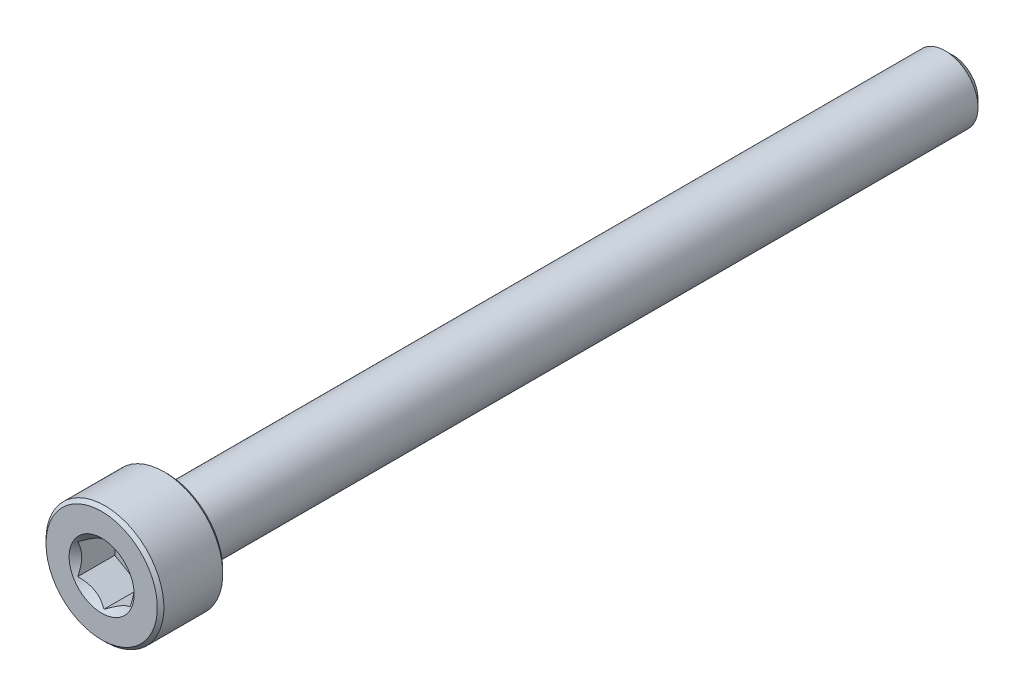
ISO-10303-21;
HEADER;
FILE_DESCRIPTION(('STEP AP214'),'2;1');
FILE_NAME('part.step','',(''),(''),'','','');
FILE_SCHEMA(('AUTOMOTIVE_DESIGN { 1 0 10303 214 1 1 1 1 }'));
ENDSEC;
DATA;
#1=APPLICATION_CONTEXT('core data for automotive mechanical design processes');
#2=APPLICATION_PROTOCOL_DEFINITION('international standard','automotive_design',2000,#1);
#3=PRODUCT_CONTEXT('',#1,'mechanical');
#4=PRODUCT('Part','Part','',(#3));
#5=PRODUCT_RELATED_PRODUCT_CATEGORY('part','',(#4));
#6=PRODUCT_DEFINITION_FORMATION('','',#4);
#7=PRODUCT_DEFINITION_CONTEXT('part definition',#1,'design');
#8=PRODUCT_DEFINITION('design','',#6,#7);
#9=PRODUCT_DEFINITION_SHAPE('','',#8);
#10=(LENGTH_UNIT() NAMED_UNIT(*) SI_UNIT(.MILLI.,.METRE.));
#11=(NAMED_UNIT(*) PLANE_ANGLE_UNIT() SI_UNIT($,.RADIAN.));
#12=(NAMED_UNIT(*) SI_UNIT($,.STERADIAN.) SOLID_ANGLE_UNIT());
#13=UNCERTAINTY_MEASURE_WITH_UNIT(LENGTH_MEASURE(1.E-05),#10,'distance_accuracy_value','');
#14=(GEOMETRIC_REPRESENTATION_CONTEXT(3) GLOBAL_UNCERTAINTY_ASSIGNED_CONTEXT((#13)) GLOBAL_UNIT_ASSIGNED_CONTEXT((#10,
#11,#12)) REPRESENTATION_CONTEXT('',''));
#15=CARTESIAN_POINT('',(0.,0.,0.));
#16=DIRECTION('',(0.,0.,1.));
#17=DIRECTION('',(1.,0.,0.));
#18=AXIS2_PLACEMENT_3D('',#15,#16,#17);
#19=CARTESIAN_POINT('',(0.,0.957716426222754,-16.25));
#20=DIRECTION('',(0.,0.,-1.));
#21=DIRECTION('',(-1.,0.,0.));
#22=AXIS2_PLACEMENT_3D('',#19,#20,#21);
#23=PLANE('',#22);
#24=CARTESIAN_POINT('',(0.,0.,-16.25));
#25=DIRECTION('',(0.,0.,-1.));
#26=DIRECTION('',(-1.,0.,0.));
#27=AXIS2_PLACEMENT_3D('',#24,#25,#26);
#28=CIRCLE('',#27,0.957716426222754);
#29=CARTESIAN_POINT('',(-0.957716426222754,0.,-16.25));
#30=VERTEX_POINT('',#29);
#31=EDGE_CURVE('E50',#30,#30,#28,.T.);
#32=ORIENTED_EDGE('',*,*,#31,.T.);
#33=EDGE_LOOP('',(#32));
#34=FACE_BOUND('',#33,.T.);
#35=ADVANCED_FACE('F37',(#34),#23,.T.);
#36=CARTESIAN_POINT('',(0.,0.,-16.25));
#37=DIRECTION('',(0.,0.,1.));
#38=DIRECTION('',(1.,0.,0.));
#39=AXIS2_PLACEMENT_3D('',#36,#37,#38);
#40=CONICAL_SURFACE('',#39,0.957716426222754,0.785398163397444);
#41=CARTESIAN_POINT('',(0.,0.,-15.9577164262228));
#42=DIRECTION('',(0.,0.,-1.));
#43=DIRECTION('',(-1.,0.,0.));
#44=AXIS2_PLACEMENT_3D('',#41,#42,#43);
#45=CIRCLE('',#44,1.25);
#46=CARTESIAN_POINT('',(-1.25,0.,-15.9577164262228));
#47=VERTEX_POINT('',#46);
#48=EDGE_CURVE('E153',#47,#47,#45,.T.);
#49=ORIENTED_EDGE('',*,*,#48,.T.);
#50=EDGE_LOOP('',(#49));
#51=FACE_BOUND('',#50,.T.);
#52=ORIENTED_EDGE('',*,*,#31,.F.);
#53=EDGE_LOOP('',(#52));
#54=FACE_BOUND('',#53,.T.);
#55=ADVANCED_FACE('F159',(#51,#54),#40,.T.);
#56=CARTESIAN_POINT('',(0.,0.,-16.25));
#57=DIRECTION('',(0.,0.,-1.));
#58=DIRECTION('',(-1.,0.,0.));
#59=AXIS2_PLACEMENT_3D('',#56,#57,#58);
#60=CYLINDRICAL_SURFACE('',#59,1.25);
#61=CARTESIAN_POINT('',(0.,0.,13.625));
#62=DIRECTION('',(0.,0.,-1.));
#63=DIRECTION('',(-1.,0.,0.));
#64=AXIS2_PLACEMENT_3D('',#61,#62,#63);
#65=CIRCLE('',#64,1.25);
#66=CARTESIAN_POINT('',(-1.25,0.,13.625));
#67=VERTEX_POINT('',#66);
#68=EDGE_CURVE('E150',#67,#67,#65,.T.);
#69=ORIENTED_EDGE('',*,*,#68,.T.);
#70=EDGE_LOOP('',(#69));
#71=FACE_BOUND('',#70,.T.);
#72=ORIENTED_EDGE('',*,*,#48,.F.);
#73=EDGE_LOOP('',(#72));
#74=FACE_BOUND('',#73,.T.);
#75=ADVANCED_FACE('F161',(#71,#74),#60,.T.);
#76=CARTESIAN_POINT('',(0.,0.,13.625));
#77=DIRECTION('',(0.,0.,-1.));
#78=DIRECTION('',(-1.,0.,0.));
#79=AXIS2_PLACEMENT_3D('',#76,#77,#78);
#80=TOROIDAL_SURFACE('',#79,1.375,0.125);
#81=CARTESIAN_POINT('',(0.,0.,13.75));
#82=DIRECTION('',(0.,0.,-1.));
#83=DIRECTION('',(-1.,0.,0.));
#84=AXIS2_PLACEMENT_3D('',#81,#82,#83);
#85=CIRCLE('',#84,1.375);
#86=CARTESIAN_POINT('',(-1.375,0.,13.75));
#87=VERTEX_POINT('',#86);
#88=EDGE_CURVE('E147',#87,#87,#85,.T.);
#89=ORIENTED_EDGE('',*,*,#88,.T.);
#90=EDGE_LOOP('',(#89));
#91=FACE_BOUND('',#90,.T.);
#92=ORIENTED_EDGE('',*,*,#68,.F.);
#93=EDGE_LOOP('',(#92));
#94=FACE_BOUND('',#93,.T.);
#95=ADVANCED_FACE('F167',(#91,#94),#80,.F.);
#96=CARTESIAN_POINT('',(0.,2.125,13.75));
#97=DIRECTION('',(0.,0.,-1.));
#98=DIRECTION('',(-1.,0.,0.));
#99=AXIS2_PLACEMENT_3D('',#96,#97,#98);
#100=PLANE('',#99);
#101=CARTESIAN_POINT('',(0.,0.,13.75));
#102=DIRECTION('',(0.,0.,-1.));
#103=DIRECTION('',(-1.,0.,0.));
#104=AXIS2_PLACEMENT_3D('',#101,#102,#103);
#105=CIRCLE('',#104,2.125);
#106=CARTESIAN_POINT('',(-2.125,0.,13.75));
#107=VERTEX_POINT('',#106);
#108=EDGE_CURVE('E144',#107,#107,#105,.T.);
#109=ORIENTED_EDGE('',*,*,#108,.T.);
#110=EDGE_LOOP('',(#109));
#111=FACE_BOUND('',#110,.T.);
#112=ORIENTED_EDGE('',*,*,#88,.F.);
#113=EDGE_LOOP('',(#112));
#114=FACE_BOUND('',#113,.T.);
#115=ADVANCED_FACE('F173',(#111,#114),#100,.T.);
#116=CARTESIAN_POINT('',(0.,0.,13.75));
#117=DIRECTION('',(0.,0.,1.));
#118=DIRECTION('',(1.,0.,0.));
#119=AXIS2_PLACEMENT_3D('',#116,#117,#118);
#120=CONICAL_SURFACE('',#119,2.125,0.78539816339745);
#121=CARTESIAN_POINT('',(0.,0.,13.875));
#122=DIRECTION('',(0.,0.,-1.));
#123=DIRECTION('',(-1.,0.,0.));
#124=AXIS2_PLACEMENT_3D('',#121,#122,#123);
#125=CIRCLE('',#124,2.25);
#126=CARTESIAN_POINT('',(-2.25,0.,13.875));
#127=VERTEX_POINT('',#126);
#128=EDGE_CURVE('E141',#127,#127,#125,.T.);
#129=ORIENTED_EDGE('',*,*,#128,.T.);
#130=EDGE_LOOP('',(#129));
#131=FACE_BOUND('',#130,.T.);
#132=ORIENTED_EDGE('',*,*,#108,.F.);
#133=EDGE_LOOP('',(#132));
#134=FACE_BOUND('',#133,.T.);
#135=ADVANCED_FACE('F177',(#131,#134),#120,.T.);
#136=CARTESIAN_POINT('',(0.,0.,-16.25));
#137=DIRECTION('',(0.,0.,-1.));
#138=DIRECTION('',(-1.,0.,0.));
#139=AXIS2_PLACEMENT_3D('',#136,#137,#138);
#140=CYLINDRICAL_SURFACE('',#139,2.25);
#141=CARTESIAN_POINT('',(0.,0.,16.125));
#142=DIRECTION('',(0.,0.,-1.));
#143=DIRECTION('',(-1.,0.,0.));
#144=AXIS2_PLACEMENT_3D('',#141,#142,#143);
#145=CIRCLE('',#144,2.25);
#146=CARTESIAN_POINT('',(-2.25,0.,16.125));
#147=VERTEX_POINT('',#146);
#148=EDGE_CURVE('E138',#147,#147,#145,.T.);
#149=ORIENTED_EDGE('',*,*,#148,.T.);
#150=EDGE_LOOP('',(#149));
#151=FACE_BOUND('',#150,.T.);
#152=ORIENTED_EDGE('',*,*,#128,.F.);
#153=EDGE_LOOP('',(#152));
#154=FACE_BOUND('',#153,.T.);
#155=ADVANCED_FACE('F181',(#151,#154),#140,.T.);
#156=CARTESIAN_POINT('',(0.,0.,16.125));
#157=DIRECTION('',(0.,0.,-1.));
#158=DIRECTION('',(-1.,0.,0.));
#159=AXIS2_PLACEMENT_3D('',#156,#157,#158);
#160=CONICAL_SURFACE('',#159,2.25,0.78539816339745);
#161=CARTESIAN_POINT('',(0.,0.,16.25));
#162=DIRECTION('',(0.,0.,-1.));
#163=DIRECTION('',(-1.,0.,0.));
#164=AXIS2_PLACEMENT_3D('',#161,#162,#163);
#165=CIRCLE('',#164,2.125);
#166=CARTESIAN_POINT('',(-2.125,0.,16.25));
#167=VERTEX_POINT('',#166);
#168=EDGE_CURVE('E135',#167,#167,#165,.T.);
#169=ORIENTED_EDGE('',*,*,#168,.T.);
#170=EDGE_LOOP('',(#169));
#171=FACE_BOUND('',#170,.T.);
#172=ORIENTED_EDGE('',*,*,#148,.F.);
#173=EDGE_LOOP('',(#172));
#174=FACE_BOUND('',#173,.T.);
#175=ADVANCED_FACE('F185',(#171,#174),#160,.T.);
#176=CARTESIAN_POINT('',(0.,0.,16.25));
#177=DIRECTION('',(0.,0.,1.));
#178=DIRECTION('',(1.,0.,0.));
#179=AXIS2_PLACEMENT_3D('',#176,#177,#178);
#180=PLANE('',#179);
#181=CARTESIAN_POINT('',(0.,0.,16.25));
#182=DIRECTION('',(0.,0.,1.));
#183=DIRECTION('',(1.,0.,0.));
#184=AXIS2_PLACEMENT_3D('',#181,#182,#183);
#185=CIRCLE('',#184,1.2413030787577);
#186=CARTESIAN_POINT('',(1.2413030787577,0.,16.25));
#187=VERTEX_POINT('',#186);
#188=EDGE_CURVE('E109',#187,#187,#185,.T.);
#189=ORIENTED_EDGE('',*,*,#188,.F.);
#190=EDGE_LOOP('',(#189));
#191=FACE_BOUND('',#190,.T.);
#192=ORIENTED_EDGE('',*,*,#168,.F.);
#193=EDGE_LOOP('',(#192));
#194=FACE_BOUND('',#193,.T.);
#195=ADVANCED_FACE('F189',(#191,#194),#180,.T.);
#196=CARTESIAN_POINT('',(0.,0.,16.25));
#197=DIRECTION('',(0.,0.,1.));
#198=DIRECTION('',(1.,0.,0.));
#199=AXIS2_PLACEMENT_3D('',#196,#197,#198);
#200=CONICAL_SURFACE('',#199,1.2413030787577,0.78539816339745);
#201=ORIENTED_EDGE('',*,*,#188,.T.);
#202=EDGE_LOOP('',(#201));
#203=FACE_BOUND('',#202,.T.);
#204=CARTESIAN_POINT('',(-0.000199999999999918,-1.15481600843309,16.1635129469942));
#205=CARTESIAN_POINT('',(0.0341825950071801,-1.13496520795026,16.1436753904473));
#206=CARTESIAN_POINT('',(0.0691401181398238,-1.11478247255942,16.1250024802604));
#207=CARTESIAN_POINT('',(0.140422802956088,-1.07362739529219,16.0908122023447));
#208=CARTESIAN_POINT('',(0.176754750528982,-1.0526511355808,16.075313868645));
#209=CARTESIAN_POINT('',(0.250016613803309,-1.01035337909803,16.0487647667638));
#210=CARTESIAN_POINT('',(0.286927851445413,-0.989042666109242,16.0376472336185));
#211=CARTESIAN_POINT('',(0.361562729310858,-0.945952199282692,16.0205173253977));
#212=CARTESIAN_POINT('',(0.399284088108634,-0.924173762626597,16.0144921570882));
#213=CARTESIAN_POINT('',(0.464292198417932,-0.886641312640016,16.009058014589));
#214=CARTESIAN_POINT('',(0.49149437152817,-0.870936130672276,16.0082543979383));
#215=CARTESIAN_POINT('',(0.54584604066911,-0.839556179862849,16.0096041590384));
#216=CARTESIAN_POINT('',(0.572995523754874,-0.823881418494925,16.0117581891688));
#217=CARTESIAN_POINT('',(0.654056277326958,-0.777080970599368,16.02251443175));
#218=CARTESIAN_POINT('',(0.707564140978425,-0.746188191116431,16.0354120160369));
#219=CARTESIAN_POINT('',(0.80147606514343,-0.69196811641965,16.0665381902237));
#220=CARTESIAN_POINT('',(0.842320523671833,-0.668386557293372,16.0831352573234));
#221=CARTESIAN_POINT('',(0.922409637381944,-0.622147085933681,16.1205223843068));
#222=CARTESIAN_POINT('',(0.961659010870438,-0.599486449584575,16.141298801439));
#223=CARTESIAN_POINT('',(1.0002,-0.577234799135787,16.1635129469942));
#224=B_SPLINE_CURVE_WITH_KNOTS('',3,(#204,#205,#206,#207,#208,#209,#210,#211,#212,#213,#214,
#215,#216,#217,#218,#219,#220,#221,#222,#223),.UNSPECIFIED.,.F.,.F.,(4,2,2,2,2,2,2,2,2,4),(0.,
0.133237676828558,0.267252229834489,0.399137076269299,0.530689603280767,0.624814864263845,
0.718960890149132,0.907306626112096,1.0571010036179,1.20641411519286),.UNSPECIFIED.);
#225=CARTESIAN_POINT('',(0.,-1.15470053837925,16.1633974596216));
#226=VERTEX_POINT('',#225);
#227=CARTESIAN_POINT('',(1.,-0.577350269189626,16.1633974596216));
#228=VERTEX_POINT('',#227);
#229=EDGE_CURVE('E12',#226,#228,#224,.T.);
#230=ORIENTED_EDGE('',*,*,#229,.F.);
#231=CARTESIAN_POINT('',(-1.0002,-0.577234799135788,16.1635129469942));
#232=CARTESIAN_POINT('',(-0.96581740499282,-0.597085599618621,16.1436753904473));
#233=CARTESIAN_POINT('',(-0.930859881860176,-0.617268335009456,16.1250024802604));
#234=CARTESIAN_POINT('',(-0.859577197043912,-0.658423412276685,16.0908122023447));
#235=CARTESIAN_POINT('',(-0.823245249471017,-0.679399671988079,16.075313868645));
#236=CARTESIAN_POINT('',(-0.74998338619669,-0.721697428470846,16.0487647667638));
#237=CARTESIAN_POINT('',(-0.713072148554587,-0.743008141459636,16.0376472336185));
#238=CARTESIAN_POINT('',(-0.638437270689142,-0.786098608286185,16.0205173253977));
#239=CARTESIAN_POINT('',(-0.600715911891366,-0.80787704494228,16.0144921570882));
#240=CARTESIAN_POINT('',(-0.535707801582068,-0.845409494928862,16.009058014589));
#241=CARTESIAN_POINT('',(-0.50850562847183,-0.861114676896601,16.0082543979383));
#242=CARTESIAN_POINT('',(-0.45415395933089,-0.892494627706028,16.0096041590384));
#243=CARTESIAN_POINT('',(-0.427004476245126,-0.908169389073953,16.0117581891688));
#244=CARTESIAN_POINT('',(-0.345943722673042,-0.954969836969509,16.02251443175));
#245=CARTESIAN_POINT('',(-0.292435859021575,-0.985862616452446,16.0354120160369));
#246=CARTESIAN_POINT('',(-0.19852393485657,-1.04008269114923,16.0665381902237));
#247=CARTESIAN_POINT('',(-0.157679476328166,-1.06366425027551,16.0831352573234));
#248=CARTESIAN_POINT('',(-0.077590362618056,-1.1099037216352,16.1205223843068));
#249=CARTESIAN_POINT('',(-0.0383409891295615,-1.1325643579843,16.141298801439));
#250=CARTESIAN_POINT('',(0.000200000000001109,-1.15481600843309,16.1635129469942));
#251=B_SPLINE_CURVE_WITH_KNOTS('',3,(#231,#232,#233,#234,#235,#236,#237,#238,#239,#240,#241,
#242,#243,#244,#245,#246,#247,#248,#249,#250),.UNSPECIFIED.,.F.,.F.,(4,2,2,2,2,2,2,2,2,4),(0.,
0.133237676828559,0.267252229834491,0.3991370762693,0.530689603280767,0.624814864263845,
0.718960890149132,0.907306626112096,1.0571010036179,1.20641411519286),.UNSPECIFIED.);
#252=CARTESIAN_POINT('',(-1.,-0.577350269189626,16.1633974596216));
#253=VERTEX_POINT('',#252);
#254=EDGE_CURVE('E95',#253,#226,#251,.T.);
#255=ORIENTED_EDGE('',*,*,#254,.F.);
#256=CARTESIAN_POINT('',(-1.,-1.21199087789934,16.5799772552729));
#257=CARTESIAN_POINT('',(-1.,-1.18273650300522,16.5574155469366));
#258=CARTESIAN_POINT('',(-1.,-1.15332592158341,16.5350570338119));
#259=CARTESIAN_POINT('',(-1.,-1.09412680336146,16.4908320719692));
#260=CARTESIAN_POINT('',(-1.,-1.06433818018076,16.4689657389968));
#261=CARTESIAN_POINT('',(-1.,-0.973871293541522,16.4039212875776));
#262=CARTESIAN_POINT('',(-1.,-0.912535008128869,16.3616436137258));
#263=CARTESIAN_POINT('',(-1.,-0.783508251342878,16.27806824785));
#264=CARTESIAN_POINT('',(-1.,-0.71566262034661,16.2370076103326));
#265=CARTESIAN_POINT('',(-1.,-0.576509894905895,16.1615014706694));
#266=CARTESIAN_POINT('',(-1.,-0.505215555513885,16.1270336262159));
#267=CARTESIAN_POINT('',(-1.,-0.398764046939013,16.0848487824633));
#268=CARTESIAN_POINT('',(-1.,-0.365313297980424,16.0728493894825));
#269=CARTESIAN_POINT('',(-1.,-0.297551245132094,16.0515303099529));
#270=CARTESIAN_POINT('',(-1.,-0.263239887100779,16.0422107924589));
#271=CARTESIAN_POINT('',(-1.,-0.194571067470057,16.026911675875));
#272=CARTESIAN_POINT('',(-1.,-0.160227555987669,16.0208704830847));
#273=CARTESIAN_POINT('',(-1.,-0.0910948269867772,16.0122522450376));
#274=CARTESIAN_POINT('',(-1.,-0.0563055613802761,16.009675576765));
#275=CARTESIAN_POINT('',(-1.,0.0117927152654019,16.0082129551204));
#276=CARTESIAN_POINT('',(-1.,0.0450983170825074,16.0091670383534));
#277=CARTESIAN_POINT('',(-1.,0.111441413420384,16.014343622111));
#278=CARTESIAN_POINT('',(-1.,0.144478971732107,16.0185653204679));
#279=CARTESIAN_POINT('',(-1.,0.210624763290573,16.0301084789686));
#280=CARTESIAN_POINT('',(-1.,0.243723154740699,16.0374854347904));
#281=CARTESIAN_POINT('',(-1.,0.309187738497537,16.0549289992095));
#282=CARTESIAN_POINT('',(-1.,0.341553969590707,16.0649954649653));
#283=CARTESIAN_POINT('',(-1.,0.440875348086757,16.0997425706523));
#284=CARTESIAN_POINT('',(-1.,0.506480526276308,16.1282699754181));
#285=CARTESIAN_POINT('',(-1.,0.634628446237202,16.1917592247633));
#286=CARTESIAN_POINT('',(-1.,0.697159414671819,16.2267436843145));
#287=CARTESIAN_POINT('',(-1.,0.816694357126201,16.2989855582188));
#288=CARTESIAN_POINT('',(-1.,0.873818851530731,16.3360460703574));
#289=CARTESIAN_POINT('',(-1.,0.957979712513757,16.39336695644));
#290=CARTESIAN_POINT('',(-1.,0.985671461150839,16.4126817594542));
#291=CARTESIAN_POINT('',(-1.,1.04067496120981,16.4518298926459));
#292=CARTESIAN_POINT('',(-1.,1.06798681474317,16.4716630791934));
#293=CARTESIAN_POINT('',(-1.,1.09514019811391,16.4917114368574));
#294=B_SPLINE_CURVE_WITH_KNOTS('',3,(#256,#257,#258,#259,#260,#261,#262,#263,#264,#265,#266,
#267,#268,#269,#270,#271,#272,#273,#274,#275,#276,#277,#278,#279,#280,#281,#282,#283,#284,#285,
#286,#287,#288,#289,#290,#291,#292,#293),.UNSPECIFIED.,.F.,.F.,(4,2,2,2,2,2,2,2,2,2,2,2,2,2,2,2,
2,2,4),(0.,0.110828944200308,0.221683685263865,0.445078388583641,0.682811068621034,
0.919723239940845,1.02624790401867,1.13277928653702,1.23723298361624,1.34169804566787,
1.44148938783186,1.54125623996228,1.64285505347063,1.74444847208079,1.95844200767913,
2.17319976124347,2.3773768581412,2.47865984803709,2.57991506662172),.UNSPECIFIED.);
#295=CARTESIAN_POINT('',(-1.,0.577350269189625,16.1633974596216));
#296=VERTEX_POINT('',#295);
#297=EDGE_CURVE('E108',#296,#253,#294,.F.);
#298=ORIENTED_EDGE('',*,*,#297,.F.);
#299=CARTESIAN_POINT('',(0.000200000000000042,1.15481600843309,16.1635129469942));
#300=CARTESIAN_POINT('',(-0.0341825950071801,1.13496520795026,16.1436753904473));
#301=CARTESIAN_POINT('',(-0.0691401181398239,1.11478247255942,16.1250024802604));
#302=CARTESIAN_POINT('',(-0.140422802956088,1.07362739529219,16.0908122023447));
#303=CARTESIAN_POINT('',(-0.176754750528983,1.0526511355808,16.075313868645));
#304=CARTESIAN_POINT('',(-0.25001661380331,1.01035337909803,16.0487647667638));
#305=CARTESIAN_POINT('',(-0.286927851445413,0.989042666109241,16.0376472336185));
#306=CARTESIAN_POINT('',(-0.361562729310858,0.945952199282692,16.0205173253977));
#307=CARTESIAN_POINT('',(-0.399284088108634,0.924173762626597,16.0144921570882));
#308=CARTESIAN_POINT('',(-0.464292198417932,0.886641312640016,16.009058014589));
#309=CARTESIAN_POINT('',(-0.49149437152817,0.870936130672277,16.0082543979383));
#310=CARTESIAN_POINT('',(-0.54584604066911,0.839556179862849,16.0096041590384));
#311=CARTESIAN_POINT('',(-0.572995523754874,0.823881418494925,16.0117581891688));
#312=CARTESIAN_POINT('',(-0.654056277326958,0.777080970599368,16.02251443175));
#313=CARTESIAN_POINT('',(-0.707564140978425,0.746188191116431,16.0354120160369));
#314=CARTESIAN_POINT('',(-0.80147606514343,0.69196811641965,16.0665381902237));
#315=CARTESIAN_POINT('',(-0.842320523671833,0.668386557293372,16.0831352573234));
#316=CARTESIAN_POINT('',(-0.922409637381944,0.622147085933681,16.1205223843068));
#317=CARTESIAN_POINT('',(-0.961659010870438,0.599486449584575,16.141298801439));
#318=CARTESIAN_POINT('',(-1.0002,0.577234799135787,16.1635129469942));
#319=B_SPLINE_CURVE_WITH_KNOTS('',3,(#299,#300,#301,#302,#303,#304,#305,#306,#307,#308,#309,
#310,#311,#312,#313,#314,#315,#316,#317,#318),.UNSPECIFIED.,.F.,.F.,(4,2,2,2,2,2,2,2,2,4),(0.,
0.133237676828559,0.26725222983449,0.3991370762693,0.530689603280767,0.624814864263845,
0.718960890149132,0.907306626112096,1.0571010036179,1.20641411519286),.UNSPECIFIED.);
#320=CARTESIAN_POINT('',(0.,1.15470053837925,16.1633974596216));
#321=VERTEX_POINT('',#320);
#322=EDGE_CURVE('E239',#321,#296,#319,.T.);
#323=ORIENTED_EDGE('',*,*,#322,.F.);
#324=CARTESIAN_POINT('',(1.0002,0.577234799135788,16.1635129469942));
#325=CARTESIAN_POINT('',(0.96581740499282,0.597085599618621,16.1436753904473));
#326=CARTESIAN_POINT('',(0.930859881860176,0.617268335009456,16.1250024802604));
#327=CARTESIAN_POINT('',(0.859577197043912,0.658423412276685,16.0908122023447));
#328=CARTESIAN_POINT('',(0.823245249471017,0.679399671988079,16.075313868645));
#329=CARTESIAN_POINT('',(0.74998338619669,0.721697428470845,16.0487647667638));
#330=CARTESIAN_POINT('',(0.713072148554587,0.743008141459636,16.0376472336185));
#331=CARTESIAN_POINT('',(0.638437270689142,0.786098608286185,16.0205173253977));
#332=CARTESIAN_POINT('',(0.600715911891366,0.80787704494228,16.0144921570882));
#333=CARTESIAN_POINT('',(0.535707801582068,0.845409494928862,16.009058014589));
#334=CARTESIAN_POINT('',(0.50850562847183,0.861114676896601,16.0082543979383));
#335=CARTESIAN_POINT('',(0.45415395933089,0.892494627706028,16.0096041590384));
#336=CARTESIAN_POINT('',(0.427004476245126,0.908169389073953,16.0117581891688));
#337=CARTESIAN_POINT('',(0.345943722673042,0.95496983696951,16.02251443175));
#338=CARTESIAN_POINT('',(0.292435859021575,0.985862616452446,16.0354120160369));
#339=CARTESIAN_POINT('',(0.19852393485657,1.04008269114923,16.0665381902237));
#340=CARTESIAN_POINT('',(0.157679476328166,1.06366425027551,16.0831352573234));
#341=CARTESIAN_POINT('',(0.0775903626180559,1.1099037216352,16.1205223843068));
#342=CARTESIAN_POINT('',(0.0383409891295615,1.1325643579843,16.141298801439));
#343=CARTESIAN_POINT('',(-0.000200000000000939,1.15481600843309,16.1635129469942));
#344=B_SPLINE_CURVE_WITH_KNOTS('',3,(#324,#325,#326,#327,#328,#329,#330,#331,#332,#333,#334,
#335,#336,#337,#338,#339,#340,#341,#342,#343),.UNSPECIFIED.,.F.,.F.,(4,2,2,2,2,2,2,2,2,4),(0.,
0.133237676828559,0.26725222983449,0.3991370762693,0.530689603280767,0.624814864263845,
0.718960890149132,0.907306626112096,1.0571010036179,1.20641411519286),.UNSPECIFIED.);
#345=CARTESIAN_POINT('',(1.,0.577350269189626,16.1633974596216));
#346=VERTEX_POINT('',#345);
#347=EDGE_CURVE('E212',#346,#321,#344,.T.);
#348=ORIENTED_EDGE('',*,*,#347,.F.);
#349=CARTESIAN_POINT('',(1.,-1.21199087789934,16.5799772552729));
#350=CARTESIAN_POINT('',(1.,-1.18273650300522,16.5574155469366));
#351=CARTESIAN_POINT('',(1.,-1.15332592158341,16.5350570338119));
#352=CARTESIAN_POINT('',(1.,-1.09412680336146,16.4908320719692));
#353=CARTESIAN_POINT('',(1.,-1.06433818018075,16.4689657389968));
#354=CARTESIAN_POINT('',(1.,-0.97387129354152,16.4039212875776));
#355=CARTESIAN_POINT('',(1.,-0.912535008128868,16.3616436137258));
#356=CARTESIAN_POINT('',(1.,-0.783508251342877,16.27806824785));
#357=CARTESIAN_POINT('',(1.,-0.715662620346609,16.2370076103326));
#358=CARTESIAN_POINT('',(1.,-0.576509894905894,16.1615014706694));
#359=CARTESIAN_POINT('',(1.,-0.505215555513885,16.1270336262159));
#360=CARTESIAN_POINT('',(1.,-0.398764046939013,16.0848487824633));
#361=CARTESIAN_POINT('',(1.,-0.365313297980424,16.0728493894825));
#362=CARTESIAN_POINT('',(1.,-0.297551245132094,16.0515303099529));
#363=CARTESIAN_POINT('',(1.,-0.263239887100778,16.0422107924589));
#364=CARTESIAN_POINT('',(1.,-0.194571067470057,16.026911675875));
#365=CARTESIAN_POINT('',(1.,-0.160227555987668,16.0208704830847));
#366=CARTESIAN_POINT('',(1.,-0.0910948269867769,16.0122522450376));
#367=CARTESIAN_POINT('',(1.,-0.0563055613802758,16.009675576765));
#368=CARTESIAN_POINT('',(1.,0.0117927152654022,16.0082129551204));
#369=CARTESIAN_POINT('',(1.,0.0450983170825078,16.0091670383534));
#370=CARTESIAN_POINT('',(1.,0.111441413420384,16.014343622111));
#371=CARTESIAN_POINT('',(1.,0.144478971732107,16.0185653204679));
#372=CARTESIAN_POINT('',(1.,0.210624763290573,16.0301084789686));
#373=CARTESIAN_POINT('',(1.,0.243723154740699,16.0374854347904));
#374=CARTESIAN_POINT('',(1.,0.309187738497537,16.0549289992095));
#375=CARTESIAN_POINT('',(1.,0.341553969590707,16.0649954649653));
#376=CARTESIAN_POINT('',(1.,0.440875348086756,16.0997425706523));
#377=CARTESIAN_POINT('',(1.,0.506480526276305,16.1282699754181));
#378=CARTESIAN_POINT('',(1.,0.634628446237199,16.1917592247633));
#379=CARTESIAN_POINT('',(1.,0.697159414671816,16.2267436843145));
#380=CARTESIAN_POINT('',(1.,0.816694357126199,16.2989855582188));
#381=CARTESIAN_POINT('',(1.,0.873818851530729,16.3360460703574));
#382=CARTESIAN_POINT('',(1.,0.957979712513757,16.39336695644));
#383=CARTESIAN_POINT('',(1.,0.985671461150839,16.4126817594542));
#384=CARTESIAN_POINT('',(1.,1.04067496120981,16.4518298926459));
#385=CARTESIAN_POINT('',(1.,1.06798681474317,16.4716630791934));
#386=CARTESIAN_POINT('',(1.,1.09514019811391,16.4917114368574));
#387=B_SPLINE_CURVE_WITH_KNOTS('',3,(#349,#350,#351,#352,#353,#354,#355,#356,#357,#358,#359,
#360,#361,#362,#363,#364,#365,#366,#367,#368,#369,#370,#371,#372,#373,#374,#375,#376,#377,#378,
#379,#380,#381,#382,#383,#384,#385,#386),.UNSPECIFIED.,.F.,.F.,(4,2,2,2,2,2,2,2,2,2,2,2,2,2,2,2,
2,2,4),(0.,0.110828944200309,0.221683685263869,0.445078388583644,0.682811068621034,
0.919723239940845,1.02624790401867,1.13277928653702,1.23723298361624,1.34169804566787,
1.44148938783186,1.54125623996228,1.64285505347063,1.74444847208079,1.95844200767913,
2.17319976124347,2.3773768581412,2.47865984803709,2.57991506662172),.UNSPECIFIED.);
#388=EDGE_CURVE('E57',#228,#346,#387,.T.);
#389=ORIENTED_EDGE('',*,*,#388,.F.);
#390=EDGE_LOOP('',(#230,#255,#298,#323,#348,#389));
#391=FACE_BOUND('',#390,.T.);
#392=ADVANCED_FACE('F94',(#203,#391),#200,.F.);
#393=CARTESIAN_POINT('',(0.,2.125,14.75));
#394=DIRECTION('',(0.,0.,-1.));
#395=DIRECTION('',(-1.,0.,0.));
#396=AXIS2_PLACEMENT_3D('',#393,#394,#395);
#397=PLANE('',#396);
#398=DIRECTION('',(0.866025403784439,0.5,0.));
#399=VECTOR('',#398,1.);
#400=CARTESIAN_POINT('',(0.,-1.15470053837925,14.75));
#401=LINE('',#400,#399);
#402=CARTESIAN_POINT('',(0.,-1.15470053837925,14.75));
#403=VERTEX_POINT('',#402);
#404=CARTESIAN_POINT('',(1.,-0.577350269189626,14.75));
#405=VERTEX_POINT('',#404);
#406=EDGE_CURVE('E112',#403,#405,#401,.T.);
#407=ORIENTED_EDGE('',*,*,#406,.T.);
#408=DIRECTION('',(0.,1.,0.));
#409=VECTOR('',#408,1.);
#410=CARTESIAN_POINT('',(1.,-0.577350269189626,14.75));
#411=LINE('',#410,#409);
#412=CARTESIAN_POINT('',(1.,0.577350269189626,14.75));
#413=VERTEX_POINT('',#412);
#414=EDGE_CURVE('E64',#405,#413,#411,.T.);
#415=ORIENTED_EDGE('',*,*,#414,.T.);
#416=DIRECTION('',(-0.866025403784439,0.5,0.));
#417=VECTOR('',#416,1.);
#418=CARTESIAN_POINT('',(1.,0.577350269189626,14.75));
#419=LINE('',#418,#417);
#420=CARTESIAN_POINT('',(0.,1.15470053837925,14.75));
#421=VERTEX_POINT('',#420);
#422=EDGE_CURVE('E120',#413,#421,#419,.T.);
#423=ORIENTED_EDGE('',*,*,#422,.T.);
#424=DIRECTION('',(-0.866025403784438,-0.5,0.));
#425=VECTOR('',#424,1.);
#426=CARTESIAN_POINT('',(0.,1.15470053837925,14.75));
#427=LINE('',#426,#425);
#428=CARTESIAN_POINT('',(-1.,0.577350269189626,14.75));
#429=VERTEX_POINT('',#428);
#430=EDGE_CURVE('E127',#421,#429,#427,.T.);
#431=ORIENTED_EDGE('',*,*,#430,.T.);
#432=DIRECTION('',(0.,-1.,0.));
#433=VECTOR('',#432,1.);
#434=CARTESIAN_POINT('',(-1.,0.577350269189626,14.75));
#435=LINE('',#434,#433);
#436=CARTESIAN_POINT('',(-1.,-0.577350269189626,14.75));
#437=VERTEX_POINT('',#436);
#438=EDGE_CURVE('E123',#429,#437,#435,.T.);
#439=ORIENTED_EDGE('',*,*,#438,.T.);
#440=DIRECTION('',(0.866025403784439,-0.5,0.));
#441=VECTOR('',#440,1.);
#442=CARTESIAN_POINT('',(-1.,-0.577350269189626,14.75));
#443=LINE('',#442,#441);
#444=EDGE_CURVE('E113',#437,#403,#443,.T.);
#445=ORIENTED_EDGE('',*,*,#444,.T.);
#446=EDGE_LOOP('',(#407,#415,#423,#431,#439,#445));
#447=FACE_BOUND('',#446,.T.);
#448=ADVANCED_FACE('F194',(#447),#397,.F.);
#449=CARTESIAN_POINT('',(0.,-1.15470053837925,10.6949495366961));
#450=DIRECTION('',(0.5,-0.866025403784438,0.));
#451=DIRECTION('',(0.866025403784439,0.5,0.));
#452=AXIS2_PLACEMENT_3D('',#449,#450,#451);
#453=PLANE('',#452);
#454=DIRECTION('',(0.,0.,1.));
#455=VECTOR('',#454,1.);
#456=CARTESIAN_POINT('',(0.,-1.15470053837925,10.6949495366961));
#457=LINE('',#456,#455);
#458=EDGE_CURVE('E104',#403,#226,#457,.T.);
#459=ORIENTED_EDGE('',*,*,#458,.T.);
#460=ORIENTED_EDGE('',*,*,#229,.T.);
#461=DIRECTION('',(0.,0.,1.));
#462=VECTOR('',#461,1.);
#463=CARTESIAN_POINT('',(1.,-0.577350269189626,10.6949495366961));
#464=LINE('',#463,#462);
#465=EDGE_CURVE('E115',#405,#228,#464,.T.);
#466=ORIENTED_EDGE('',*,*,#465,.F.);
#467=ORIENTED_EDGE('',*,*,#406,.F.);
#468=EDGE_LOOP('',(#459,#460,#466,#467));
#469=FACE_BOUND('',#468,.T.);
#470=ADVANCED_FACE('F111',(#469),#453,.F.);
#471=CARTESIAN_POINT('',(-1.,-0.577350269189626,10.6949495366961));
#472=DIRECTION('',(-0.5,-0.866025403784439,0.));
#473=DIRECTION('',(0.866025403784439,-0.5,0.));
#474=AXIS2_PLACEMENT_3D('',#471,#472,#473);
#475=PLANE('',#474);
#476=DIRECTION('',(0.,0.,1.));
#477=VECTOR('',#476,1.);
#478=CARTESIAN_POINT('',(-1.,-0.577350269189626,10.6949495366961));
#479=LINE('',#478,#477);
#480=EDGE_CURVE('E107',#437,#253,#479,.T.);
#481=ORIENTED_EDGE('',*,*,#480,.T.);
#482=ORIENTED_EDGE('',*,*,#254,.T.);
#483=ORIENTED_EDGE('',*,*,#458,.F.);
#484=ORIENTED_EDGE('',*,*,#444,.F.);
#485=EDGE_LOOP('',(#481,#482,#483,#484));
#486=FACE_BOUND('',#485,.T.);
#487=ADVANCED_FACE('F103',(#486),#475,.F.);
#488=CARTESIAN_POINT('',(-1.,0.577350269189626,10.6949495366961));
#489=DIRECTION('',(-1.,0.,0.));
#490=DIRECTION('',(0.,0.,1.));
#491=AXIS2_PLACEMENT_3D('',#488,#489,#490);
#492=PLANE('',#491);
#493=DIRECTION('',(0.,0.,1.));
#494=VECTOR('',#493,1.);
#495=CARTESIAN_POINT('',(-1.,0.577350269189626,10.6949495366961));
#496=LINE('',#495,#494);
#497=EDGE_CURVE('E124',#429,#296,#496,.T.);
#498=ORIENTED_EDGE('',*,*,#497,.T.);
#499=ORIENTED_EDGE('',*,*,#297,.T.);
#500=ORIENTED_EDGE('',*,*,#480,.F.);
#501=ORIENTED_EDGE('',*,*,#438,.F.);
#502=EDGE_LOOP('',(#498,#499,#500,#501));
#503=FACE_BOUND('',#502,.T.);
#504=ADVANCED_FACE('F248',(#503),#492,.F.);
#505=CARTESIAN_POINT('',(0.,1.15470053837925,10.6949495366961));
#506=DIRECTION('',(-0.5,0.866025403784438,0.));
#507=DIRECTION('',(-0.866025403784438,-0.5,0.));
#508=AXIS2_PLACEMENT_3D('',#505,#506,#507);
#509=PLANE('',#508);
#510=DIRECTION('',(0.,0.,1.));
#511=VECTOR('',#510,1.);
#512=CARTESIAN_POINT('',(0.,1.15470053837925,10.6949495366961));
#513=LINE('',#512,#511);
#514=EDGE_CURVE('E128',#421,#321,#513,.T.);
#515=ORIENTED_EDGE('',*,*,#514,.T.);
#516=ORIENTED_EDGE('',*,*,#322,.T.);
#517=ORIENTED_EDGE('',*,*,#497,.F.);
#518=ORIENTED_EDGE('',*,*,#430,.F.);
#519=EDGE_LOOP('',(#515,#516,#517,#518));
#520=FACE_BOUND('',#519,.T.);
#521=ADVANCED_FACE('F245',(#520),#509,.F.);
#522=CARTESIAN_POINT('',(1.,0.577350269189626,10.6949495366961));
#523=DIRECTION('',(0.5,0.866025403784439,0.));
#524=DIRECTION('',(-0.866025403784439,0.5,0.));
#525=AXIS2_PLACEMENT_3D('',#522,#523,#524);
#526=PLANE('',#525);
#527=DIRECTION('',(0.,0.,1.));
#528=VECTOR('',#527,1.);
#529=CARTESIAN_POINT('',(1.,0.577350269189626,10.6949495366961));
#530=LINE('',#529,#528);
#531=EDGE_CURVE('E131',#413,#346,#530,.T.);
#532=ORIENTED_EDGE('',*,*,#531,.T.);
#533=ORIENTED_EDGE('',*,*,#347,.T.);
#534=ORIENTED_EDGE('',*,*,#514,.F.);
#535=ORIENTED_EDGE('',*,*,#422,.F.);
#536=EDGE_LOOP('',(#532,#533,#534,#535));
#537=FACE_BOUND('',#536,.T.);
#538=ADVANCED_FACE('F202',(#537),#526,.F.);
#539=CARTESIAN_POINT('',(1.,-0.577350269189626,10.6949495366961));
#540=DIRECTION('',(1.,0.,0.));
#541=DIRECTION('',(0.,0.,-1.));
#542=AXIS2_PLACEMENT_3D('',#539,#540,#541);
#543=PLANE('',#542);
#544=ORIENTED_EDGE('',*,*,#465,.T.);
#545=ORIENTED_EDGE('',*,*,#388,.T.);
#546=ORIENTED_EDGE('',*,*,#531,.F.);
#547=ORIENTED_EDGE('',*,*,#414,.F.);
#548=EDGE_LOOP('',(#544,#545,#546,#547));
#549=FACE_BOUND('',#548,.T.);
#550=ADVANCED_FACE('F198',(#549),#543,.F.);
#551=CLOSED_SHELL('',(#35,#55,#75,#95,#115,#135,#155,#175,#195,#392,#448,#470,#487,#504,#521,
#538,#550));
#552=MANIFOLD_SOLID_BREP('B2',#551);
#553=ADVANCED_BREP_SHAPE_REPRESENTATION('',(#18,#552),#14);
#554=SHAPE_DEFINITION_REPRESENTATION(#9,#553);
ENDSEC;
END-ISO-10303-21;
